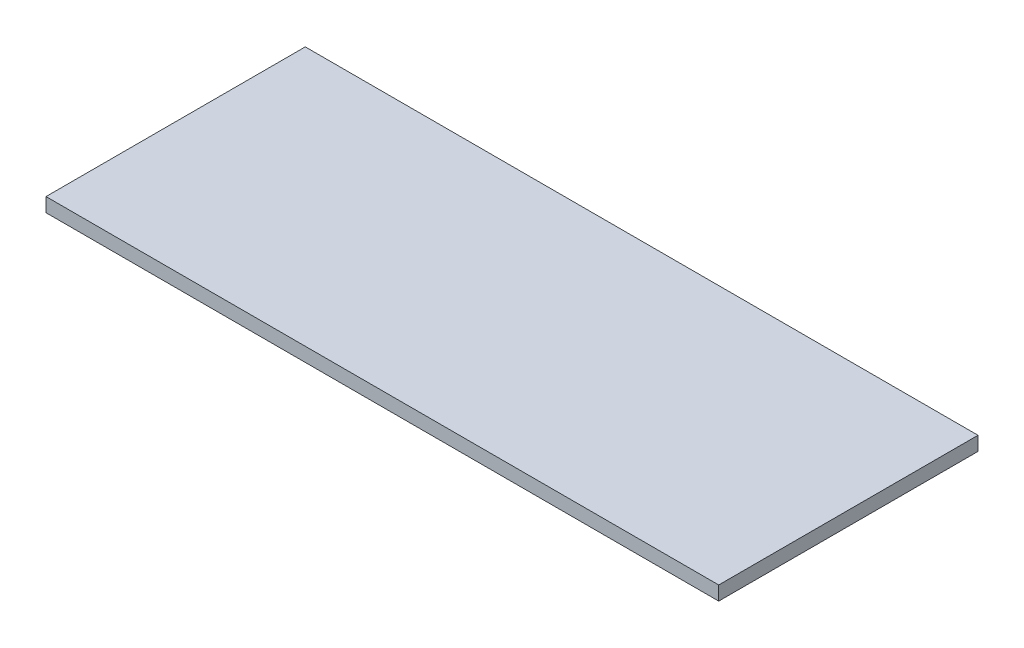
ISO-10303-21;
HEADER;
FILE_DESCRIPTION(('STEP AP214'),'2;1');
FILE_NAME('part.step','',(''),(''),'','','');
FILE_SCHEMA(('AUTOMOTIVE_DESIGN { 1 0 10303 214 1 1 1 1 }'));
ENDSEC;
DATA;
#1=APPLICATION_CONTEXT('core data for automotive mechanical design processes');
#2=APPLICATION_PROTOCOL_DEFINITION('international standard','automotive_design',2000,#1);
#3=PRODUCT_CONTEXT('',#1,'mechanical');
#4=PRODUCT('Part','Part','',(#3));
#5=PRODUCT_RELATED_PRODUCT_CATEGORY('part','',(#4));
#6=PRODUCT_DEFINITION_FORMATION('','',#4);
#7=PRODUCT_DEFINITION_CONTEXT('part definition',#1,'design');
#8=PRODUCT_DEFINITION('design','',#6,#7);
#9=PRODUCT_DEFINITION_SHAPE('','',#8);
#10=(LENGTH_UNIT() NAMED_UNIT(*) SI_UNIT(.MILLI.,.METRE.));
#11=(NAMED_UNIT(*) PLANE_ANGLE_UNIT() SI_UNIT($,.RADIAN.));
#12=(NAMED_UNIT(*) SI_UNIT($,.STERADIAN.) SOLID_ANGLE_UNIT());
#13=UNCERTAINTY_MEASURE_WITH_UNIT(LENGTH_MEASURE(1.E-05),#10,'distance_accuracy_value','');
#14=(GEOMETRIC_REPRESENTATION_CONTEXT(3) GLOBAL_UNCERTAINTY_ASSIGNED_CONTEXT((#13)) GLOBAL_UNIT_ASSIGNED_CONTEXT((#10,
#11,#12)) REPRESENTATION_CONTEXT('',''));
#15=CARTESIAN_POINT('',(0.,0.,0.));
#16=DIRECTION('',(0.,0.,1.));
#17=DIRECTION('',(1.,0.,0.));
#18=AXIS2_PLACEMENT_3D('',#15,#16,#17);
#19=CARTESIAN_POINT('',(304.8,12.7,0.));
#20=DIRECTION('',(-1.,0.,0.));
#21=DIRECTION('',(0.,0.,1.));
#22=AXIS2_PLACEMENT_3D('',#19,#20,#21);
#23=PLANE('',#22);
#24=DIRECTION('',(0.,0.,-1.));
#25=VECTOR('',#24,1.);
#26=CARTESIAN_POINT('',(304.8,0.,0.));
#27=LINE('',#26,#25);
#28=CARTESIAN_POINT('',(304.8,0.,0.));
#29=VERTEX_POINT('',#28);
#30=CARTESIAN_POINT('',(304.8,0.,-234.95));
#31=VERTEX_POINT('',#30);
#32=EDGE_CURVE('E96',#29,#31,#27,.T.);
#33=ORIENTED_EDGE('',*,*,#32,.T.);
#34=DIRECTION('',(0.,-1.,0.));
#35=VECTOR('',#34,1.);
#36=CARTESIAN_POINT('',(304.8,12.7,-234.95));
#37=LINE('',#36,#35);
#38=CARTESIAN_POINT('',(304.8,12.7,-234.95));
#39=VERTEX_POINT('',#38);
#40=EDGE_CURVE('E11',#39,#31,#37,.T.);
#41=ORIENTED_EDGE('',*,*,#40,.F.);
#42=DIRECTION('',(0.,0.,-1.));
#43=VECTOR('',#42,1.);
#44=CARTESIAN_POINT('',(304.8,12.7,0.));
#45=LINE('',#44,#43);
#46=CARTESIAN_POINT('',(304.8,12.7,0.));
#47=VERTEX_POINT('',#46);
#48=EDGE_CURVE('E84',#47,#39,#45,.T.);
#49=ORIENTED_EDGE('',*,*,#48,.F.);
#50=DIRECTION('',(0.,-1.,0.));
#51=VECTOR('',#50,1.);
#52=CARTESIAN_POINT('',(304.8,12.7,0.));
#53=LINE('',#52,#51);
#54=EDGE_CURVE('E92',#47,#29,#53,.T.);
#55=ORIENTED_EDGE('',*,*,#54,.T.);
#56=EDGE_LOOP('',(#33,#41,#49,#55));
#57=FACE_BOUND('',#56,.T.);
#58=ADVANCED_FACE('F33',(#57),#23,.F.);
#59=CARTESIAN_POINT('',(-304.8,12.7,-234.95));
#60=DIRECTION('',(0.,0.,1.));
#61=DIRECTION('',(1.,0.,0.));
#62=AXIS2_PLACEMENT_3D('',#59,#60,#61);
#63=PLANE('',#62);
#64=DIRECTION('',(-1.,0.,0.));
#65=VECTOR('',#64,1.);
#66=CARTESIAN_POINT('',(-304.8,0.,-234.95));
#67=LINE('',#66,#65);
#68=CARTESIAN_POINT('',(-304.8,0.,-234.95));
#69=VERTEX_POINT('',#68);
#70=EDGE_CURVE('E88',#31,#69,#67,.T.);
#71=ORIENTED_EDGE('',*,*,#70,.T.);
#72=DIRECTION('',(0.,-1.,0.));
#73=VECTOR('',#72,1.);
#74=CARTESIAN_POINT('',(-304.8,12.7,-234.95));
#75=LINE('',#74,#73);
#76=CARTESIAN_POINT('',(-304.8,12.7,-234.95));
#77=VERTEX_POINT('',#76);
#78=EDGE_CURVE('E41',#77,#69,#75,.T.);
#79=ORIENTED_EDGE('',*,*,#78,.F.);
#80=DIRECTION('',(-1.,0.,0.));
#81=VECTOR('',#80,1.);
#82=CARTESIAN_POINT('',(-304.8,12.7,-234.95));
#83=LINE('',#82,#81);
#84=EDGE_CURVE('E79',#39,#77,#83,.T.);
#85=ORIENTED_EDGE('',*,*,#84,.F.);
#86=ORIENTED_EDGE('',*,*,#40,.T.);
#87=EDGE_LOOP('',(#71,#79,#85,#86));
#88=FACE_BOUND('',#87,.T.);
#89=ADVANCED_FACE('F87',(#88),#63,.F.);
#90=CARTESIAN_POINT('',(-304.8,12.7,0.));
#91=DIRECTION('',(1.,0.,0.));
#92=DIRECTION('',(0.,0.,-1.));
#93=AXIS2_PLACEMENT_3D('',#90,#91,#92);
#94=PLANE('',#93);
#95=DIRECTION('',(0.,0.,1.));
#96=VECTOR('',#95,1.);
#97=CARTESIAN_POINT('',(-304.8,0.,0.));
#98=LINE('',#97,#96);
#99=CARTESIAN_POINT('',(-304.8,0.,0.));
#100=VERTEX_POINT('',#99);
#101=EDGE_CURVE('E66',#69,#100,#98,.T.);
#102=ORIENTED_EDGE('',*,*,#101,.T.);
#103=DIRECTION('',(0.,-1.,0.));
#104=VECTOR('',#103,1.);
#105=CARTESIAN_POINT('',(-304.8,12.7,0.));
#106=LINE('',#105,#104);
#107=CARTESIAN_POINT('',(-304.8,12.7,0.));
#108=VERTEX_POINT('',#107);
#109=EDGE_CURVE('E89',#108,#100,#106,.T.);
#110=ORIENTED_EDGE('',*,*,#109,.F.);
#111=DIRECTION('',(0.,0.,1.));
#112=VECTOR('',#111,1.);
#113=CARTESIAN_POINT('',(-304.8,12.7,0.));
#114=LINE('',#113,#112);
#115=EDGE_CURVE('E82',#77,#108,#114,.T.);
#116=ORIENTED_EDGE('',*,*,#115,.F.);
#117=ORIENTED_EDGE('',*,*,#78,.T.);
#118=EDGE_LOOP('',(#102,#110,#116,#117));
#119=FACE_BOUND('',#118,.T.);
#120=ADVANCED_FACE('F90',(#119),#94,.F.);
#121=CARTESIAN_POINT('',(-304.8,12.7,0.));
#122=DIRECTION('',(0.,0.,-1.));
#123=DIRECTION('',(-1.,0.,0.));
#124=AXIS2_PLACEMENT_3D('',#121,#122,#123);
#125=PLANE('',#124);
#126=DIRECTION('',(1.,0.,0.));
#127=VECTOR('',#126,1.);
#128=CARTESIAN_POINT('',(-304.8,0.,0.));
#129=LINE('',#128,#127);
#130=EDGE_CURVE('E72',#100,#29,#129,.T.);
#131=ORIENTED_EDGE('',*,*,#130,.T.);
#132=ORIENTED_EDGE('',*,*,#54,.F.);
#133=DIRECTION('',(1.,0.,0.));
#134=VECTOR('',#133,1.);
#135=CARTESIAN_POINT('',(-304.8,12.7,0.));
#136=LINE('',#135,#134);
#137=EDGE_CURVE('E49',#108,#47,#136,.T.);
#138=ORIENTED_EDGE('',*,*,#137,.F.);
#139=ORIENTED_EDGE('',*,*,#109,.T.);
#140=EDGE_LOOP('',(#131,#132,#138,#139));
#141=FACE_BOUND('',#140,.T.);
#142=ADVANCED_FACE('F103',(#141),#125,.F.);
#143=CARTESIAN_POINT('',(0.,12.7,0.));
#144=DIRECTION('',(0.,-1.,0.));
#145=DIRECTION('',(0.,0.,-1.));
#146=AXIS2_PLACEMENT_3D('',#143,#144,#145);
#147=PLANE('',#146);
#148=ORIENTED_EDGE('',*,*,#48,.T.);
#149=ORIENTED_EDGE('',*,*,#84,.T.);
#150=ORIENTED_EDGE('',*,*,#115,.T.);
#151=ORIENTED_EDGE('',*,*,#137,.T.);
#152=EDGE_LOOP('',(#148,#149,#150,#151));
#153=FACE_BOUND('',#152,.T.);
#154=ADVANCED_FACE('F80',(#153),#147,.F.);
#155=CARTESIAN_POINT('',(0.,0.,0.));
#156=DIRECTION('',(0.,-1.,0.));
#157=DIRECTION('',(0.,0.,-1.));
#158=AXIS2_PLACEMENT_3D('',#155,#156,#157);
#159=PLANE('',#158);
#160=ORIENTED_EDGE('',*,*,#32,.F.);
#161=ORIENTED_EDGE('',*,*,#130,.F.);
#162=ORIENTED_EDGE('',*,*,#101,.F.);
#163=ORIENTED_EDGE('',*,*,#70,.F.);
#164=EDGE_LOOP('',(#160,#161,#162,#163));
#165=FACE_BOUND('',#164,.T.);
#166=ADVANCED_FACE('F106',(#165),#159,.T.);
#167=CLOSED_SHELL('',(#58,#89,#120,#142,#154,#166));
#168=MANIFOLD_SOLID_BREP('B2',#167);
#169=ADVANCED_BREP_SHAPE_REPRESENTATION('',(#18,#168),#14);
#170=SHAPE_DEFINITION_REPRESENTATION(#9,#169);
ENDSEC;
END-ISO-10303-21;
